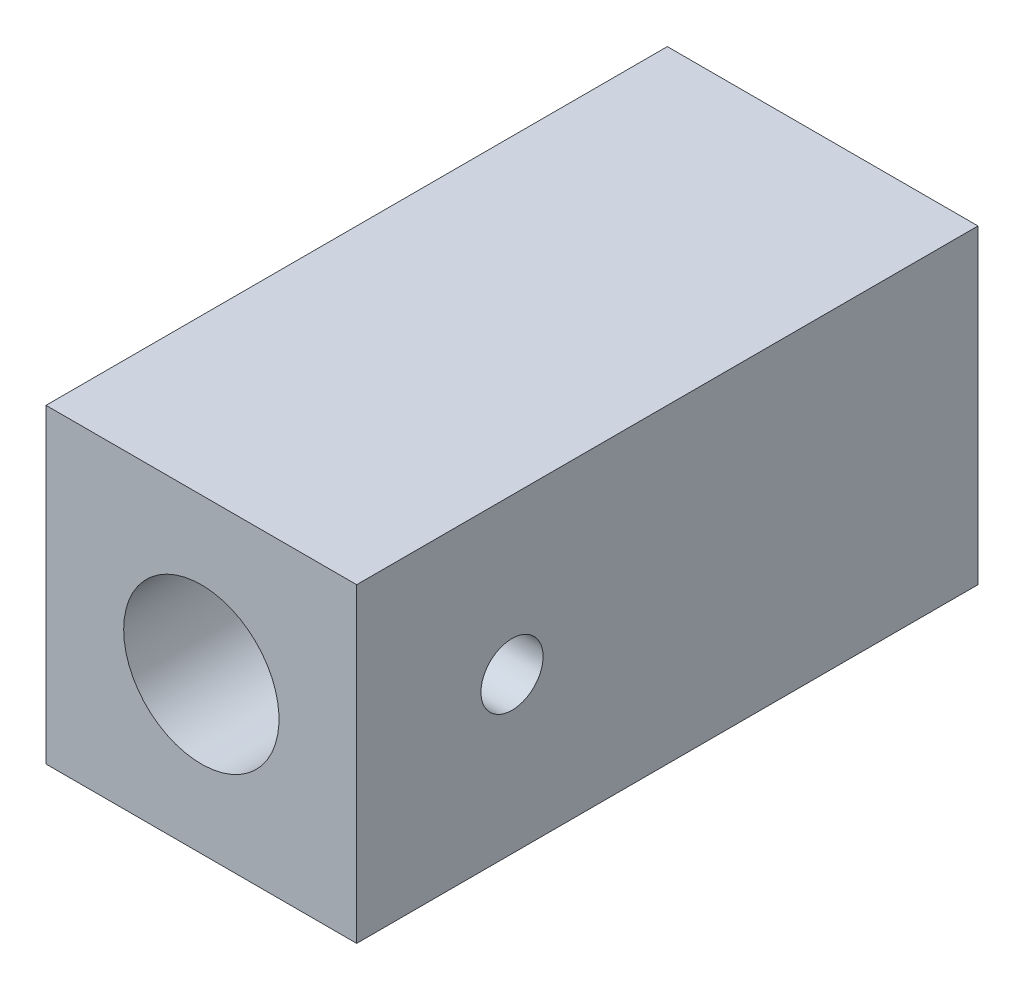
ISO-10303-21;
HEADER;
FILE_DESCRIPTION(('STEP AP214'),'2;1');
FILE_NAME('part.step','',(''),(''),'','','');
FILE_SCHEMA(('AUTOMOTIVE_DESIGN { 1 0 10303 214 1 1 1 1 }'));
ENDSEC;
DATA;
#1=APPLICATION_CONTEXT('core data for automotive mechanical design processes');
#2=APPLICATION_PROTOCOL_DEFINITION('international standard','automotive_design',2000,#1);
#3=PRODUCT_CONTEXT('',#1,'mechanical');
#4=PRODUCT('Part','Part','',(#3));
#5=PRODUCT_RELATED_PRODUCT_CATEGORY('part','',(#4));
#6=PRODUCT_DEFINITION_FORMATION('','',#4);
#7=PRODUCT_DEFINITION_CONTEXT('part definition',#1,'design');
#8=PRODUCT_DEFINITION('design','',#6,#7);
#9=PRODUCT_DEFINITION_SHAPE('','',#8);
#10=(LENGTH_UNIT() NAMED_UNIT(*) SI_UNIT(.MILLI.,.METRE.));
#11=(NAMED_UNIT(*) PLANE_ANGLE_UNIT() SI_UNIT($,.RADIAN.));
#12=(NAMED_UNIT(*) SI_UNIT($,.STERADIAN.) SOLID_ANGLE_UNIT());
#13=UNCERTAINTY_MEASURE_WITH_UNIT(LENGTH_MEASURE(1.E-05),#10,'distance_accuracy_value','');
#14=(GEOMETRIC_REPRESENTATION_CONTEXT(3) GLOBAL_UNCERTAINTY_ASSIGNED_CONTEXT((#13)) GLOBAL_UNIT_ASSIGNED_CONTEXT((#10,
#11,#12)) REPRESENTATION_CONTEXT('',''));
#15=CARTESIAN_POINT('',(0.,0.,0.));
#16=DIRECTION('',(0.,0.,1.));
#17=DIRECTION('',(1.,0.,0.));
#18=AXIS2_PLACEMENT_3D('',#15,#16,#17);
#19=CARTESIAN_POINT('',(5.,-5.,10.));
#20=DIRECTION('',(-1.,0.,0.));
#21=DIRECTION('',(0.,-1.,0.));
#22=AXIS2_PLACEMENT_3D('',#19,#20,#21);
#23=PLANE('',#22);
#24=CARTESIAN_POINT('',(5.,0.,5.));
#25=DIRECTION('',(-1.,0.,0.));
#26=DIRECTION('',(0.,-1.,0.));
#27=AXIS2_PLACEMENT_3D('',#24,#25,#26);
#28=CIRCLE('',#27,1.);
#29=CARTESIAN_POINT('',(5.,-1.,5.));
#30=VERTEX_POINT('',#29);
#31=EDGE_CURVE('E131',#30,#30,#28,.T.);
#32=ORIENTED_EDGE('',*,*,#31,.T.);
#33=EDGE_LOOP('',(#32));
#34=FACE_BOUND('',#33,.T.);
#35=DIRECTION('',(0.,0.,-1.));
#36=VECTOR('',#35,1.);
#37=CARTESIAN_POINT('',(5.,-5.,10.));
#38=LINE('',#37,#36);
#39=CARTESIAN_POINT('',(5.,-5.,10.));
#40=VERTEX_POINT('',#39);
#41=CARTESIAN_POINT('',(5.,-5.,-10.));
#42=VERTEX_POINT('',#41);
#43=EDGE_CURVE('E90',#40,#42,#38,.T.);
#44=ORIENTED_EDGE('',*,*,#43,.T.);
#45=DIRECTION('',(0.,-1.,0.));
#46=VECTOR('',#45,1.);
#47=CARTESIAN_POINT('',(5.,5.,-10.));
#48=LINE('',#47,#46);
#49=CARTESIAN_POINT('',(5.,5.,-10.));
#50=VERTEX_POINT('',#49);
#51=EDGE_CURVE('E94',#50,#42,#48,.T.);
#52=ORIENTED_EDGE('',*,*,#51,.F.);
#53=DIRECTION('',(0.,0.,-1.));
#54=VECTOR('',#53,1.);
#55=CARTESIAN_POINT('',(5.,5.,10.));
#56=LINE('',#55,#54);
#57=CARTESIAN_POINT('',(5.,5.,10.));
#58=VERTEX_POINT('',#57);
#59=EDGE_CURVE('E11',#58,#50,#56,.T.);
#60=ORIENTED_EDGE('',*,*,#59,.F.);
#61=DIRECTION('',(0.,1.,0.));
#62=VECTOR('',#61,1.);
#63=CARTESIAN_POINT('',(5.,-5.,10.));
#64=LINE('',#63,#62);
#65=EDGE_CURVE('E95',#40,#58,#64,.T.);
#66=ORIENTED_EDGE('',*,*,#65,.F.);
#67=EDGE_LOOP('',(#44,#52,#60,#66));
#68=FACE_BOUND('',#67,.T.);
#69=ADVANCED_FACE('F43',(#34,#68),#23,.F.);
#70=CARTESIAN_POINT('',(-5.,5.,10.));
#71=DIRECTION('',(0.,-1.,0.));
#72=DIRECTION('',(1.,0.,0.));
#73=AXIS2_PLACEMENT_3D('',#70,#71,#72);
#74=PLANE('',#73);
#75=ORIENTED_EDGE('',*,*,#59,.T.);
#76=DIRECTION('',(1.,0.,0.));
#77=VECTOR('',#76,1.);
#78=CARTESIAN_POINT('',(5.,5.,-10.));
#79=LINE('',#78,#77);
#80=CARTESIAN_POINT('',(-5.,5.,-10.));
#81=VERTEX_POINT('',#80);
#82=EDGE_CURVE('E112',#81,#50,#79,.T.);
#83=ORIENTED_EDGE('',*,*,#82,.F.);
#84=DIRECTION('',(0.,0.,-1.));
#85=VECTOR('',#84,1.);
#86=CARTESIAN_POINT('',(-5.,5.,10.));
#87=LINE('',#86,#85);
#88=CARTESIAN_POINT('',(-5.,5.,10.));
#89=VERTEX_POINT('',#88);
#90=EDGE_CURVE('E57',#89,#81,#87,.T.);
#91=ORIENTED_EDGE('',*,*,#90,.F.);
#92=DIRECTION('',(-1.,0.,0.));
#93=VECTOR('',#92,1.);
#94=CARTESIAN_POINT('',(-5.,5.,10.));
#95=LINE('',#94,#93);
#96=EDGE_CURVE('E145',#58,#89,#95,.T.);
#97=ORIENTED_EDGE('',*,*,#96,.F.);
#98=EDGE_LOOP('',(#75,#83,#91,#97));
#99=FACE_BOUND('',#98,.T.);
#100=ADVANCED_FACE('F185',(#99),#74,.F.);
#101=CARTESIAN_POINT('',(-5.,-5.,10.));
#102=DIRECTION('',(1.,0.,0.));
#103=DIRECTION('',(0.,0.,-1.));
#104=AXIS2_PLACEMENT_3D('',#101,#102,#103);
#105=PLANE('',#104);
#106=CARTESIAN_POINT('',(-5.,0.,5.));
#107=DIRECTION('',(1.,0.,0.));
#108=DIRECTION('',(0.,0.,-1.));
#109=AXIS2_PLACEMENT_3D('',#106,#107,#108);
#110=CIRCLE('',#109,1.);
#111=CARTESIAN_POINT('',(-5.,0.,4.));
#112=VERTEX_POINT('',#111);
#113=EDGE_CURVE('E127',#112,#112,#110,.T.);
#114=ORIENTED_EDGE('',*,*,#113,.T.);
#115=EDGE_LOOP('',(#114));
#116=FACE_BOUND('',#115,.T.);
#117=ORIENTED_EDGE('',*,*,#90,.T.);
#118=DIRECTION('',(0.,1.,0.));
#119=VECTOR('',#118,1.);
#120=CARTESIAN_POINT('',(-5.,5.,-10.));
#121=LINE('',#120,#119);
#122=CARTESIAN_POINT('',(-5.,-5.,-10.));
#123=VERTEX_POINT('',#122);
#124=EDGE_CURVE('E107',#123,#81,#121,.T.);
#125=ORIENTED_EDGE('',*,*,#124,.F.);
#126=DIRECTION('',(0.,0.,-1.));
#127=VECTOR('',#126,1.);
#128=CARTESIAN_POINT('',(-5.,-5.,10.));
#129=LINE('',#128,#127);
#130=CARTESIAN_POINT('',(-5.,-5.,10.));
#131=VERTEX_POINT('',#130);
#132=EDGE_CURVE('E98',#131,#123,#129,.T.);
#133=ORIENTED_EDGE('',*,*,#132,.F.);
#134=DIRECTION('',(0.,-1.,0.));
#135=VECTOR('',#134,1.);
#136=CARTESIAN_POINT('',(-5.,-5.,10.));
#137=LINE('',#136,#135);
#138=EDGE_CURVE('E70',#89,#131,#137,.T.);
#139=ORIENTED_EDGE('',*,*,#138,.F.);
#140=EDGE_LOOP('',(#117,#125,#133,#139));
#141=FACE_BOUND('',#140,.T.);
#142=ADVANCED_FACE('F191',(#116,#141),#105,.F.);
#143=CARTESIAN_POINT('',(-5.,-5.,10.));
#144=DIRECTION('',(0.,1.,0.));
#145=DIRECTION('',(-1.,0.,0.));
#146=AXIS2_PLACEMENT_3D('',#143,#144,#145);
#147=PLANE('',#146);
#148=ORIENTED_EDGE('',*,*,#132,.T.);
#149=DIRECTION('',(-1.,0.,0.));
#150=VECTOR('',#149,1.);
#151=CARTESIAN_POINT('',(5.,-5.,-10.));
#152=LINE('',#151,#150);
#153=EDGE_CURVE('E101',#42,#123,#152,.T.);
#154=ORIENTED_EDGE('',*,*,#153,.F.);
#155=ORIENTED_EDGE('',*,*,#43,.F.);
#156=DIRECTION('',(1.,0.,0.));
#157=VECTOR('',#156,1.);
#158=CARTESIAN_POINT('',(-5.,-5.,10.));
#159=LINE('',#158,#157);
#160=EDGE_CURVE('E65',#131,#40,#159,.T.);
#161=ORIENTED_EDGE('',*,*,#160,.F.);
#162=EDGE_LOOP('',(#148,#154,#155,#161));
#163=FACE_BOUND('',#162,.T.);
#164=ADVANCED_FACE('F102',(#163),#147,.F.);
#165=CARTESIAN_POINT('',(0.,0.,10.));
#166=DIRECTION('',(0.,0.,-1.));
#167=DIRECTION('',(-1.,0.,0.));
#168=AXIS2_PLACEMENT_3D('',#165,#166,#167);
#169=PLANE('',#168);
#170=CARTESIAN_POINT('',(0.,0.,10.));
#171=DIRECTION('',(0.,0.,-1.));
#172=DIRECTION('',(-1.,0.,0.));
#173=AXIS2_PLACEMENT_3D('',#170,#171,#172);
#174=CIRCLE('',#173,2.5);
#175=CARTESIAN_POINT('',(-2.5,0.,10.));
#176=VERTEX_POINT('',#175);
#177=EDGE_CURVE('E135',#176,#176,#174,.T.);
#178=ORIENTED_EDGE('',*,*,#177,.T.);
#179=EDGE_LOOP('',(#178));
#180=FACE_BOUND('',#179,.T.);
#181=ORIENTED_EDGE('',*,*,#65,.T.);
#182=ORIENTED_EDGE('',*,*,#96,.T.);
#183=ORIENTED_EDGE('',*,*,#138,.T.);
#184=ORIENTED_EDGE('',*,*,#160,.T.);
#185=EDGE_LOOP('',(#181,#182,#183,#184));
#186=FACE_BOUND('',#185,.T.);
#187=ADVANCED_FACE('F202',(#180,#186),#169,.F.);
#188=CARTESIAN_POINT('',(0.,0.,-15.));
#189=DIRECTION('',(0.,0.,1.));
#190=DIRECTION('',(1.,0.,0.));
#191=AXIS2_PLACEMENT_3D('',#188,#189,#190);
#192=CYLINDRICAL_SURFACE('',#191,2.5);
#193=CARTESIAN_POINT('',(2.5,0.,4.));
#194=CARTESIAN_POINT('',(2.49999635613542,0.0537465027214458,4.00000492591186));
#195=CARTESIAN_POINT('',(2.49824647153466,0.107586282045337,4.00435887604419));
#196=CARTESIAN_POINT('',(2.49141726550321,0.213748240208948,4.02162385176062));
#197=CARTESIAN_POINT('',(2.48632889349439,0.266065888780624,4.03455813954307));
#198=CARTESIAN_POINT('',(2.47337104606559,0.367476961363702,4.06843803902942));
#199=CARTESIAN_POINT('',(2.46551068182036,0.41658033080848,4.08935742310836));
#200=CARTESIAN_POINT('',(2.44778305398039,0.510535985164184,4.13850958666327));
#201=CARTESIAN_POINT('',(2.43791648729028,0.555389738375496,4.16673982745947));
#202=CARTESIAN_POINT('',(2.41665443085209,0.641750503785197,4.23111774928047));
#203=CARTESIAN_POINT('',(2.40521148464595,0.683031136275107,4.26755332812013));
#204=CARTESIAN_POINT('',(2.38230288453097,0.759087502392361,4.34670000173839));
#205=CARTESIAN_POINT('',(2.37083722226896,0.793860053566766,4.38941414860587));
#206=CARTESIAN_POINT('',(2.34861395898568,0.85743728364644,4.48221403512113));
#207=CARTESIAN_POINT('',(2.33791057982476,0.885907490597737,4.5325432430116));
#208=CARTESIAN_POINT('',(2.31916823593396,0.933877359518574,4.63776819921002));
#209=CARTESIAN_POINT('',(2.31112800622088,0.953381282142917,4.69266176392418));
#210=CARTESIAN_POINT('',(2.29913178830409,0.981949411697934,4.80285616679605));
#211=CARTESIAN_POINT('',(2.29500710177803,0.991446982902824,4.85802561778811));
#212=CARTESIAN_POINT('',(2.29082002024572,1.00108648082001,4.96931749915364));
#213=CARTESIAN_POINT('',(2.29075562761384,1.00123300815661,5.02543944731251));
#214=CARTESIAN_POINT('',(2.29455250139997,0.992494683752272,5.13287833572902));
#215=CARTESIAN_POINT('',(2.29814087519225,0.984237657152568,5.18425785720452));
#216=CARTESIAN_POINT('',(2.30838093803918,0.959973440148909,5.28482977800336));
#217=CARTESIAN_POINT('',(2.31503316160836,0.943964897402315,5.33402179405516));
#218=CARTESIAN_POINT('',(2.33079742544265,0.904347366275535,5.43000891809802));
#219=CARTESIAN_POINT('',(2.33995689640394,0.880589931157657,5.47673461952735));
#220=CARTESIAN_POINT('',(2.35969058194945,0.826253230366106,5.56570790818078));
#221=CARTESIAN_POINT('',(2.37026532728424,0.795671402550421,5.60795380470141));
#222=CARTESIAN_POINT('',(2.39263368371135,0.725775299727216,5.690204864401));
#223=CARTESIAN_POINT('',(2.40445832488076,0.685968731485316,5.72978436472301));
#224=CARTESIAN_POINT('',(2.42729912479141,0.600157213715095,5.80184223900102));
#225=CARTESIAN_POINT('',(2.43831512222662,0.554151032667216,5.83431919870515));
#226=CARTESIAN_POINT('',(2.45857340632274,0.45603882630292,5.89180872370792));
#227=CARTESIAN_POINT('',(2.46777635047707,0.403830245673237,5.91666114059853));
#228=CARTESIAN_POINT('',(2.48307414164379,0.29551188274144,5.95708393053903));
#229=CARTESIAN_POINT('',(2.48917056731191,0.239404098424836,5.97265901877871));
#230=CARTESIAN_POINT('',(2.49728069753455,0.128447943803909,5.99322414770985));
#231=CARTESIAN_POINT('',(2.49951472916757,0.0737216469927661,5.99878622712678));
#232=CARTESIAN_POINT('',(2.50034239255315,-0.0359226549039098,6.00085655026431));
#233=CARTESIAN_POINT('',(2.49893696791146,-0.090840606611963,5.99736714077376));
#234=CARTESIAN_POINT('',(2.49278783531876,-0.196716369560995,5.981854123724));
#235=CARTESIAN_POINT('',(2.48819695672762,-0.247741245887738,5.97022100982451));
#236=CARTESIAN_POINT('',(2.4762972070275,-0.347067714030391,5.93928214584509));
#237=CARTESIAN_POINT('',(2.46898798678265,-0.395368955112424,5.91997541016566));
#238=CARTESIAN_POINT('',(2.45208297385406,-0.489539392908352,5.87360753016003));
#239=CARTESIAN_POINT('',(2.44242407989902,-0.535289011377704,5.84632726397843));
#240=CARTESIAN_POINT('',(2.42186682372762,-0.621721795623279,5.78502983804718));
#241=CARTESIAN_POINT('',(2.41096796555135,-0.662402920380564,5.75100997853869));
#242=CARTESIAN_POINT('',(2.38822558819056,-0.74036152151441,5.67456499352519));
#243=CARTESIAN_POINT('',(2.37636720712526,-0.777236966903033,5.6317332292469));
#244=CARTESIAN_POINT('',(2.35370836458566,-0.843375598706856,5.54027995849532));
#245=CARTESIAN_POINT('',(2.34290807763255,-0.872637530668756,5.49165749983003));
#246=CARTESIAN_POINT('',(2.32357149953854,-0.922903750965815,5.38926915270295));
#247=CARTESIAN_POINT('',(2.31505815442394,-0.943825297267228,5.33545800039384));
#248=CARTESIAN_POINT('',(2.30161836738966,-0.976148109852654,5.22463317414242));
#249=CARTESIAN_POINT('',(2.29668927847999,-0.987556402634659,5.16762189709379));
#250=CARTESIAN_POINT('',(2.29135879649963,-0.999857808639202,5.05643604911273));
#251=CARTESIAN_POINT('',(2.29065710504086,-1.00144854115143,5.00235258020332));
#252=CARTESIAN_POINT('',(2.29307418016549,-0.995901579638763,4.89472757114335));
#253=CARTESIAN_POINT('',(2.29619246162397,-0.988764993956892,4.84118596304871));
#254=CARTESIAN_POINT('',(2.3056332453951,-0.966535683076825,4.73833390507248));
#255=CARTESIAN_POINT('',(2.31182415913725,-0.95176874678549,4.6889398627835));
#256=CARTESIAN_POINT('',(2.32662000616348,-0.915002724245507,4.59331068519326));
#257=CARTESIAN_POINT('',(2.33522560603003,-0.893001640696908,4.54707642655009));
#258=CARTESIAN_POINT('',(2.35449304802246,-0.840936381379866,4.45619519036461));
#259=CARTESIAN_POINT('',(2.36524441156621,-0.810482667579746,4.41179066493476));
#260=CARTESIAN_POINT('',(2.38731902186119,-0.742946059635749,4.32850334139812));
#261=CARTESIAN_POINT('',(2.39864244024203,-0.705861167409062,4.28962221393584));
#262=CARTESIAN_POINT('',(2.42146783543697,-0.623252753136232,4.21589857336819));
#263=CARTESIAN_POINT('',(2.43293378981093,-0.57733800057307,4.18148134655097));
#264=CARTESIAN_POINT('',(2.45400203356858,-0.47995016014289,4.12083147868918));
#265=CARTESIAN_POINT('',(2.46360345546453,-0.42847450227362,4.09460264392374));
#266=CARTESIAN_POINT('',(2.47969857407931,-0.322369031247602,4.05168889240485));
#267=CARTESIAN_POINT('',(2.48624681527514,-0.267815809109848,4.03483533821983));
#268=CARTESIAN_POINT('',(2.49572153104683,-0.15643827314061,4.01068043952287));
#269=CARTESIAN_POINT('',(2.49865949747819,-0.0996217629294563,4.00334878162805));
#270=CARTESIAN_POINT('',(2.49987949752068,-0.0284561489454649,4.00030230951086));
#271=CARTESIAN_POINT('',(2.50000096484588,-0.0142313443703792,3.9999986956854));
#272=CARTESIAN_POINT('',(2.5,0.,4.));
#273=B_SPLINE_CURVE_WITH_KNOTS('',3,(#193,#194,#195,#196,#197,#198,#199,#200,#201,#202,#203,
#204,#205,#206,#207,#208,#209,#210,#211,#212,#213,#214,#215,#216,#217,#218,#219,#220,#221,#222,
#223,#224,#225,#226,#227,#228,#229,#230,#231,#232,#233,#234,#235,#236,#237,#238,#239,#240,#241,
#242,#243,#244,#245,#246,#247,#248,#249,#250,#251,#252,#253,#254,#255,#256,#257,#258,#259,#260,
#261,#262,#263,#264,#265,#266,#267,#268,#269,#270,#271,#272),.UNSPECIFIED.,.T.,.F.,(4,2,2,2,2,2,
2,2,2,2,2,2,2,2,2,2,2,2,2,2,2,2,2,2,2,2,2,2,2,2,2,2,2,2,2,2,2,2,2,4),(0.,0.161201493946536,
0.322841818003967,0.483955728735791,0.645013767839921,0.812986908501986,0.981041974672057,
1.15657629409608,1.33202711559134,1.49952052654414,1.66693153170244,1.82269164200686,
1.97847893628024,2.13744563149408,2.29647210969092,2.46779174593279,2.63914546419867,
2.81388456581403,2.98853478056895,3.15284592264004,3.31711446785041,3.47400227782183,
3.63091024496898,3.79261756699131,3.95438979749485,4.12684237312207,4.29932334521874,
4.47347522570414,4.64749836322967,4.80899836696374,4.97047786281523,5.12557159274385,
5.28070817902581,5.44472734028346,5.60879600674197,5.78350211766918,5.95828931820267,
6.1298215050666,6.30080626202172,6.34349022948398),.UNSPECIFIED.);
#274=CARTESIAN_POINT('',(2.5,0.,4.));
#275=VERTEX_POINT('',#274);
#276=EDGE_CURVE('E46',#275,#275,#273,.T.);
#277=ORIENTED_EDGE('',*,*,#276,.T.);
#278=EDGE_LOOP('',(#277));
#279=FACE_BOUND('',#278,.T.);
#280=CARTESIAN_POINT('',(-2.29128784747792,1.,5.));
#281=CARTESIAN_POINT('',(-2.29129325828211,0.999994127101894,4.94643025095005));
#282=CARTESIAN_POINT('',(-2.29319301242133,0.995669909297176,4.89278473264765));
#283=CARTESIAN_POINT('',(-2.30055457093922,0.978534515296365,4.78703258356147));
#284=CARTESIAN_POINT('',(-2.30602547693426,0.965701652221065,4.73493024145976));
#285=CARTESIAN_POINT('',(-2.31980227895648,0.932117516284352,4.63397352901498));
#286=CARTESIAN_POINT('',(-2.32809748178557,0.911396076262712,4.58510772631987));
#287=CARTESIAN_POINT('',(-2.3465733254764,0.862710134685805,4.49155747457019));
#288=CARTESIAN_POINT('',(-2.35675355451962,0.834747214633749,4.44687211542457));
#289=CARTESIAN_POINT('',(-2.37850432525516,0.770660987293709,4.36036979887927));
#290=CARTESIAN_POINT('',(-2.39011958979373,0.734189678863663,4.31882178853527));
#291=CARTESIAN_POINT('',(-2.41306228489405,0.654854552887021,4.24223550134231));
#292=CARTESIAN_POINT('',(-2.42438961368186,0.61198851083784,4.20719949935507));
#293=CARTESIAN_POINT('',(-2.44601703953427,0.519003155178188,4.14329680150865));
#294=CARTESIAN_POINT('',(-2.45625901841784,0.46866448280614,4.11472784926468));
#295=CARTESIAN_POINT('',(-2.47401963815773,0.363412661437559,4.0665782158051));
#296=CARTESIAN_POINT('',(-2.48153938692337,0.30850138464398,4.04699387710902));
#297=CARTESIAN_POINT('',(-2.49269162504143,0.198483213419445,4.0183292567813));
#298=CARTESIAN_POINT('',(-2.49649468387678,0.143514492402302,4.00878634295549));
#299=CARTESIAN_POINT('',(-2.50040155341352,0.0326331643188249,3.99898575716865));
#300=CARTESIAN_POINT('',(-2.50050674384656,-0.0232790829127021,3.99872462203258));
#301=CARTESIAN_POINT('',(-2.49710981410893,-0.131116247357657,4.00724138488749));
#302=CARTESIAN_POINT('',(-2.49380998385918,-0.183088726437018,4.01551238637346));
#303=CARTESIAN_POINT('',(-2.48424645734395,-0.28483655460917,4.03999643815538));
#304=CARTESIAN_POINT('',(-2.47798254360556,-0.33461174219508,4.05621007120019));
#305=CARTESIAN_POINT('',(-2.4629841222885,-0.431448969255829,4.09631824143815));
#306=CARTESIAN_POINT('',(-2.454213802334,-0.478458811689818,4.12032485740776));
#307=CARTESIAN_POINT('',(-2.43507292589849,-0.567904075370288,4.1752325034595));
#308=CARTESIAN_POINT('',(-2.42470182132537,-0.610337921358055,4.20613589654881));
#309=CARTESIAN_POINT('',(-2.40260818589167,-0.692384413996077,4.2763245679733));
#310=CARTESIAN_POINT('',(-2.3908416326012,-0.731628922636822,4.31602694629191));
#311=CARTESIAN_POINT('',(-2.36780830482389,-0.803053707692664,4.40149528591048));
#312=CARTESIAN_POINT('',(-2.35654169488173,-0.83523167187983,4.44726322407708));
#313=CARTESIAN_POINT('',(-2.33548448720906,-0.892452094371467,4.54520951120447));
#314=CARTESIAN_POINT('',(-2.3257445709069,-0.917267325867454,4.59753241524191));
#315=CARTESIAN_POINT('',(-2.30943795233662,-0.957588129983135,4.70610774523101));
#316=CARTESIAN_POINT('',(-2.3028691896167,-0.973099749202201,4.76235759238542));
#317=CARTESIAN_POINT('',(-2.29414879836282,-0.993477474415981,4.87351788871803));
#318=CARTESIAN_POINT('',(-2.29175183224038,-0.998936048404207,4.92830022356008));
#319=CARTESIAN_POINT('',(-2.29094748938549,-1.00078066322451,5.03803860388398));
#320=CARTESIAN_POINT('',(-2.29253890281231,-0.997169455296443,5.09299459163892));
#321=CARTESIAN_POINT('',(-2.29928022178566,-0.981516447394264,5.19822946747744));
#322=CARTESIAN_POINT('',(-2.30422228898885,-0.96996653101173,5.24859646869975));
#323=CARTESIAN_POINT('',(-2.31685025513936,-0.93940209345564,5.346644202393));
#324=CARTESIAN_POINT('',(-2.32453676244372,-0.920385917151198,5.39432433655366));
#325=CARTESIAN_POINT('',(-2.34216890929975,-0.874567819740729,5.48780117889774));
#326=CARTESIAN_POINT('',(-2.35219352319567,-0.847481434132299,5.53344309434723));
#327=CARTESIAN_POINT('',(-2.37325192578919,-0.786582612220939,5.61974149372083));
#328=CARTESIAN_POINT('',(-2.38428612448031,-0.752767436740993,5.6603959363978));
#329=CARTESIAN_POINT('',(-2.40710457985698,-0.676422105840243,5.73868670429961));
#330=CARTESIAN_POINT('',(-2.41888403642601,-0.633432714722551,5.77587828264552));
#331=CARTESIAN_POINT('',(-2.44109897283781,-0.541541816684423,5.84258853830517));
#332=CARTESIAN_POINT('',(-2.4515343979662,-0.492640069233933,5.87210690329862));
#333=CARTESIAN_POINT('',(-2.46991857950143,-0.390139967000882,5.92252381323061));
#334=CARTESIAN_POINT('',(-2.47786793120137,-0.336542740497035,5.94342442208289));
#335=CARTESIAN_POINT('',(-2.49036356734645,-0.226196795459614,5.97577442620381));
#336=CARTESIAN_POINT('',(-2.49491169853772,-0.169449805147136,5.98722895072003));
#337=CARTESIAN_POINT('',(-2.49989504105256,-0.0584082551731531,5.99975235081269));
#338=CARTESIAN_POINT('',(-2.50057923372437,-0.00419524629652919,6.00145006423133));
#339=CARTESIAN_POINT('',(-2.49843021189296,0.10371691786662,5.99607226035795));
#340=CARTESIAN_POINT('',(-2.49559752983456,0.15741614969731,5.98899807110719));
#341=CARTESIAN_POINT('',(-2.48685756682127,0.261085450973204,5.96672660582076));
#342=CARTESIAN_POINT('',(-2.48104740317165,0.311119402324192,5.95178552696222));
#343=CARTESIAN_POINT('',(-2.46697473916019,0.407961177379469,5.91447359771909));
#344=CARTESIAN_POINT('',(-2.45871178652006,0.454768404133637,5.89210137698983));
#345=CARTESIAN_POINT('',(-2.44009047180029,0.546101520928056,5.83944840075533));
#346=CARTESIAN_POINT('',(-2.42965564864115,0.590435193403211,5.80886185255746));
#347=CARTESIAN_POINT('',(-2.40794701593224,0.673527014262035,5.74110574041053));
#348=CARTESIAN_POINT('',(-2.3966728602525,0.712282842872877,5.70393345176994));
#349=CARTESIAN_POINT('',(-2.37368881779711,0.785600632542995,5.62134238773748));
#350=CARTESIAN_POINT('',(-2.36199516302692,0.819754443599513,5.57555556329945));
#351=CARTESIAN_POINT('',(-2.3402483573759,0.879923725219698,5.47852893128562));
#352=CARTESIAN_POINT('',(-2.33019539943728,0.905938238949994,5.42728848354507));
#353=CARTESIAN_POINT('',(-2.31379432228954,0.946995543836655,5.32548139907597));
#354=CARTESIAN_POINT('',(-2.30719459305824,0.962813757082103,5.27526738262441));
#355=CARTESIAN_POINT('',(-2.29723001801982,0.986358878909192,5.17275729018483));
#356=CARTESIAN_POINT('',(-2.29385616036088,0.994108333944007,5.12046744201652));
#357=CARTESIAN_POINT('',(-2.29162229378817,0.999232129155086,5.04531121883104));
#358=CARTESIAN_POINT('',(-2.29128555846679,1.00000248449744,5.0226623895012));
#359=CARTESIAN_POINT('',(-2.29128784747792,1.,5.));
#360=B_SPLINE_CURVE_WITH_KNOTS('',3,(#280,#281,#282,#283,#284,#285,#286,#287,#288,#289,#290,
#291,#292,#293,#294,#295,#296,#297,#298,#299,#300,#301,#302,#303,#304,#305,#306,#307,#308,#309,
#310,#311,#312,#313,#314,#315,#316,#317,#318,#319,#320,#321,#322,#323,#324,#325,#326,#327,#328,
#329,#330,#331,#332,#333,#334,#335,#336,#337,#338,#339,#340,#341,#342,#343,#344,#345,#346,#347,
#348,#349,#350,#351,#352,#353,#354,#355,#356,#357,#358,#359),.UNSPECIFIED.,.T.,.F.,(4,2,2,2,2,2,
2,2,2,2,2,2,2,2,2,2,2,2,2,2,2,2,2,2,2,2,2,2,2,2,2,2,2,2,2,2,2,2,2,4),(0.,0.160638824383827,
0.321688667911123,0.482135411646695,0.642547144119307,0.811278091422124,0.980067871741712,
1.15551334545714,1.3308873348474,1.49777091443592,1.66459222652836,1.82204322415151,
1.9795057756453,2.13934150117449,2.29923207470016,2.46962022040678,2.64006403563564,
2.81532229357288,2.99046652397056,3.15491073759216,3.31930507450975,3.47433624039578,
3.62940179322824,3.79075577323356,3.9521755725993,4.12551867120495,4.29886882423379,
4.47217743653411,4.64539187974073,4.80730519874982,4.96919400753306,5.12610997218682,
5.28305488911298,5.44693525566968,5.61088358279108,5.78498126639812,5.959099408766,
6.11758330406544,6.27562315106628,6.34358052760367),.UNSPECIFIED.);
#361=CARTESIAN_POINT('',(-2.29128784747792,1.,5.));
#362=VERTEX_POINT('',#361);
#363=EDGE_CURVE('E139',#362,#362,#360,.T.);
#364=ORIENTED_EDGE('',*,*,#363,.T.);
#365=EDGE_LOOP('',(#364));
#366=FACE_BOUND('',#365,.T.);
#367=CARTESIAN_POINT('',(0.,0.,0.));
#368=DIRECTION('',(0.,0.,-1.));
#369=DIRECTION('',(-1.,0.,0.));
#370=AXIS2_PLACEMENT_3D('',#367,#368,#369);
#371=CIRCLE('',#370,2.5);
#372=CARTESIAN_POINT('',(-2.5,0.,0.));
#373=VERTEX_POINT('',#372);
#374=EDGE_CURVE('E126',#373,#373,#371,.T.);
#375=ORIENTED_EDGE('',*,*,#374,.T.);
#376=EDGE_LOOP('',(#375));
#377=FACE_BOUND('',#376,.T.);
#378=ORIENTED_EDGE('',*,*,#177,.F.);
#379=EDGE_LOOP('',(#378));
#380=FACE_BOUND('',#379,.T.);
#381=ADVANCED_FACE('F160',(#279,#366,#377,#380),#192,.F.);
#382=CARTESIAN_POINT('',(-20.,0.,5.));
#383=DIRECTION('',(1.,0.,0.));
#384=DIRECTION('',(0.,1.,0.));
#385=AXIS2_PLACEMENT_3D('',#382,#383,#384);
#386=CYLINDRICAL_SURFACE('',#385,1.);
#387=ORIENTED_EDGE('',*,*,#363,.F.);
#388=EDGE_LOOP('',(#387));
#389=FACE_BOUND('',#388,.T.);
#390=ORIENTED_EDGE('',*,*,#113,.F.);
#391=EDGE_LOOP('',(#390));
#392=FACE_BOUND('',#391,.T.);
#393=ADVANCED_FACE('F168',(#389,#392),#386,.F.);
#394=ORIENTED_EDGE('',*,*,#276,.F.);
#395=EDGE_LOOP('',(#394));
#396=FACE_BOUND('',#395,.T.);
#397=ORIENTED_EDGE('',*,*,#31,.F.);
#398=EDGE_LOOP('',(#397));
#399=FACE_BOUND('',#398,.T.);
#400=ADVANCED_FACE('F163',(#396,#399),#386,.F.);
#401=CARTESIAN_POINT('',(0.,0.,0.));
#402=DIRECTION('',(0.,0.,-1.));
#403=DIRECTION('',(-1.,0.,0.));
#404=AXIS2_PLACEMENT_3D('',#401,#402,#403);
#405=PLANE('',#404);
#406=CARTESIAN_POINT('',(0.,0.,0.));
#407=DIRECTION('',(0.,0.,-1.));
#408=DIRECTION('',(-1.,0.,0.));
#409=AXIS2_PLACEMENT_3D('',#406,#407,#408);
#410=CIRCLE('',#409,2.);
#411=CARTESIAN_POINT('',(-2.,0.,0.));
#412=VERTEX_POINT('',#411);
#413=EDGE_CURVE('E114',#412,#412,#410,.T.);
#414=ORIENTED_EDGE('',*,*,#413,.T.);
#415=EDGE_LOOP('',(#414));
#416=FACE_BOUND('',#415,.T.);
#417=ORIENTED_EDGE('',*,*,#374,.F.);
#418=EDGE_LOOP('',(#417));
#419=FACE_BOUND('',#418,.T.);
#420=ADVANCED_FACE('F167',(#416,#419),#405,.F.);
#421=CARTESIAN_POINT('',(0.,0.,-10.));
#422=DIRECTION('',(0.,0.,-1.));
#423=DIRECTION('',(-1.,0.,0.));
#424=AXIS2_PLACEMENT_3D('',#421,#422,#423);
#425=PLANE('',#424);
#426=CARTESIAN_POINT('',(0.,0.,-10.));
#427=DIRECTION('',(0.,0.,-1.));
#428=DIRECTION('',(-1.,0.,0.));
#429=AXIS2_PLACEMENT_3D('',#426,#427,#428);
#430=CIRCLE('',#429,2.);
#431=CARTESIAN_POINT('',(-2.,0.,-10.));
#432=VERTEX_POINT('',#431);
#433=EDGE_CURVE('E118',#432,#432,#430,.T.);
#434=ORIENTED_EDGE('',*,*,#433,.F.);
#435=EDGE_LOOP('',(#434));
#436=FACE_BOUND('',#435,.T.);
#437=ORIENTED_EDGE('',*,*,#51,.T.);
#438=ORIENTED_EDGE('',*,*,#153,.T.);
#439=ORIENTED_EDGE('',*,*,#124,.T.);
#440=ORIENTED_EDGE('',*,*,#82,.T.);
#441=EDGE_LOOP('',(#437,#438,#439,#440));
#442=FACE_BOUND('',#441,.T.);
#443=ADVANCED_FACE('F110',(#436,#442),#425,.T.);
#444=CARTESIAN_POINT('',(0.,0.,10.));
#445=DIRECTION('',(0.,0.,-1.));
#446=DIRECTION('',(-1.,0.,0.));
#447=AXIS2_PLACEMENT_3D('',#444,#445,#446);
#448=CYLINDRICAL_SURFACE('',#447,2.);
#449=ORIENTED_EDGE('',*,*,#433,.T.);
#450=EDGE_LOOP('',(#449));
#451=FACE_BOUND('',#450,.T.);
#452=ORIENTED_EDGE('',*,*,#413,.F.);
#453=EDGE_LOOP('',(#452));
#454=FACE_BOUND('',#453,.T.);
#455=ADVANCED_FACE('F176',(#451,#454),#448,.F.);
#456=CLOSED_SHELL('',(#69,#100,#142,#164,#187,#381,#393,#400,#420,#443,#455));
#457=MANIFOLD_SOLID_BREP('B2',#456);
#458=ADVANCED_BREP_SHAPE_REPRESENTATION('',(#18,#457),#14);
#459=SHAPE_DEFINITION_REPRESENTATION(#9,#458);
ENDSEC;
END-ISO-10303-21;
